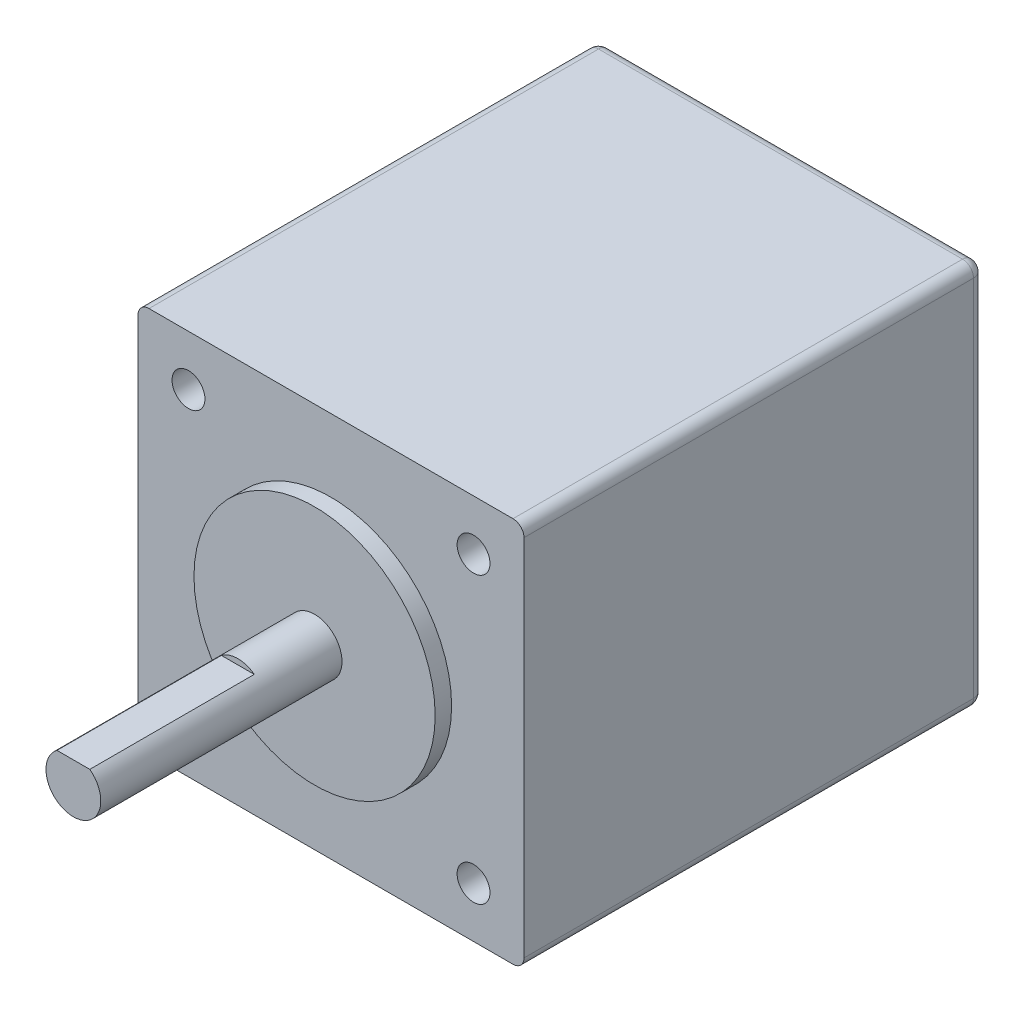
ISO-10303-21;
HEADER;
FILE_DESCRIPTION(('STEP AP214'),'2;1');
FILE_NAME('part.step','',(''),(''),'','','');
FILE_SCHEMA(('AUTOMOTIVE_DESIGN { 1 0 10303 214 1 1 1 1 }'));
ENDSEC;
DATA;
#1=APPLICATION_CONTEXT('core data for automotive mechanical design processes');
#2=APPLICATION_PROTOCOL_DEFINITION('international standard','automotive_design',2000,#1);
#3=PRODUCT_CONTEXT('',#1,'mechanical');
#4=PRODUCT('Part','Part','',(#3));
#5=PRODUCT_RELATED_PRODUCT_CATEGORY('part','',(#4));
#6=PRODUCT_DEFINITION_FORMATION('','',#4);
#7=PRODUCT_DEFINITION_CONTEXT('part definition',#1,'design');
#8=PRODUCT_DEFINITION('design','',#6,#7);
#9=PRODUCT_DEFINITION_SHAPE('','',#8);
#10=(LENGTH_UNIT() NAMED_UNIT(*) SI_UNIT(.MILLI.,.METRE.));
#11=(NAMED_UNIT(*) PLANE_ANGLE_UNIT() SI_UNIT($,.RADIAN.));
#12=(NAMED_UNIT(*) SI_UNIT($,.STERADIAN.) SOLID_ANGLE_UNIT());
#13=UNCERTAINTY_MEASURE_WITH_UNIT(LENGTH_MEASURE(1.E-05),#10,'distance_accuracy_value','');
#14=(GEOMETRIC_REPRESENTATION_CONTEXT(3) GLOBAL_UNCERTAINTY_ASSIGNED_CONTEXT((#13)) GLOBAL_UNIT_ASSIGNED_CONTEXT((#10,
#11,#12)) REPRESENTATION_CONTEXT('',''));
#15=CARTESIAN_POINT('',(0.,0.,0.));
#16=DIRECTION('',(0.,0.,1.));
#17=DIRECTION('',(1.,0.,0.));
#18=AXIS2_PLACEMENT_3D('',#15,#16,#17);
#19=CARTESIAN_POINT('',(0.,0.,43.5));
#20=DIRECTION('',(0.,0.,1.));
#21=DIRECTION('',(1.,0.,0.));
#22=AXIS2_PLACEMENT_3D('',#19,#20,#21);
#23=PLANE('',#22);
#24=CARTESIAN_POINT('',(0.,0.,43.5));
#25=DIRECTION('',(0.,0.,1.));
#26=DIRECTION('',(1.,0.,0.));
#27=AXIS2_PLACEMENT_3D('',#24,#25,#26);
#28=CIRCLE('',#27,11.);
#29=CARTESIAN_POINT('',(11.,0.,43.5));
#30=VERTEX_POINT('',#29);
#31=EDGE_CURVE('E144',#30,#30,#28,.T.);
#32=ORIENTED_EDGE('',*,*,#31,.T.);
#33=EDGE_LOOP('',(#32));
#34=FACE_BOUND('',#33,.T.);
#35=CARTESIAN_POINT('',(0.,0.,43.5));
#36=DIRECTION('',(0.,0.,1.));
#37=DIRECTION('',(1.,0.,0.));
#38=AXIS2_PLACEMENT_3D('',#35,#36,#37);
#39=CIRCLE('',#38,2.5);
#40=CARTESIAN_POINT('',(2.5,0.,43.5));
#41=VERTEX_POINT('',#40);
#42=EDGE_CURVE('E145',#41,#41,#39,.T.);
#43=ORIENTED_EDGE('',*,*,#42,.F.);
#44=EDGE_LOOP('',(#43));
#45=FACE_BOUND('',#44,.T.);
#46=ADVANCED_FACE('F33',(#34,#45),#23,.T.);
#47=CARTESIAN_POINT('',(17.6,17.6,42.));
#48=DIRECTION('',(0.,0.,-1.));
#49=DIRECTION('',(-1.,0.,0.));
#50=AXIS2_PLACEMENT_3D('',#47,#48,#49);
#51=PLANE('',#50);
#52=CARTESIAN_POINT('',(-12.9999999999997,-13.,42.));
#53=DIRECTION('',(0.,0.,1.));
#54=DIRECTION('',(1.,0.,0.));
#55=AXIS2_PLACEMENT_3D('',#52,#53,#54);
#56=CIRCLE('',#55,1.5);
#57=CARTESIAN_POINT('',(-11.4999999999997,-13.,42.));
#58=VERTEX_POINT('',#57);
#59=EDGE_CURVE('E237',#58,#58,#56,.T.);
#60=ORIENTED_EDGE('',*,*,#59,.F.);
#61=EDGE_LOOP('',(#60));
#62=FACE_BOUND('',#61,.T.);
#63=CARTESIAN_POINT('',(13.0000000000003,-12.9999999999997,42.));
#64=DIRECTION('',(0.,0.,1.));
#65=DIRECTION('',(1.,0.,0.));
#66=AXIS2_PLACEMENT_3D('',#63,#64,#65);
#67=CIRCLE('',#66,1.5);
#68=CARTESIAN_POINT('',(14.5000000000003,-12.9999999999997,42.));
#69=VERTEX_POINT('',#68);
#70=EDGE_CURVE('E245',#69,#69,#67,.T.);
#71=ORIENTED_EDGE('',*,*,#70,.F.);
#72=EDGE_LOOP('',(#71));
#73=FACE_BOUND('',#72,.T.);
#74=CARTESIAN_POINT('',(13.,13.0000000000003,42.));
#75=DIRECTION('',(0.,0.,1.));
#76=DIRECTION('',(1.,0.,0.));
#77=AXIS2_PLACEMENT_3D('',#74,#75,#76);
#78=CIRCLE('',#77,1.5);
#79=CARTESIAN_POINT('',(14.5,13.0000000000003,42.));
#80=VERTEX_POINT('',#79);
#81=EDGE_CURVE('E251',#80,#80,#78,.T.);
#82=ORIENTED_EDGE('',*,*,#81,.F.);
#83=EDGE_LOOP('',(#82));
#84=FACE_BOUND('',#83,.T.);
#85=CARTESIAN_POINT('',(-13.,13.,42.));
#86=DIRECTION('',(0.,0.,1.));
#87=DIRECTION('',(1.,0.,0.));
#88=AXIS2_PLACEMENT_3D('',#85,#86,#87);
#89=CIRCLE('',#88,1.5);
#90=CARTESIAN_POINT('',(-11.5,13.,42.));
#91=VERTEX_POINT('',#90);
#92=EDGE_CURVE('E257',#91,#91,#89,.T.);
#93=ORIENTED_EDGE('',*,*,#92,.F.);
#94=EDGE_LOOP('',(#93));
#95=FACE_BOUND('',#94,.T.);
#96=DIRECTION('',(0.,-1.,0.));
#97=VECTOR('',#96,1.);
#98=CARTESIAN_POINT('',(-17.6,-17.6,42.));
#99=LINE('',#98,#97);
#100=CARTESIAN_POINT('',(-17.6,16.6,42.));
#101=VERTEX_POINT('',#100);
#102=CARTESIAN_POINT('',(-17.6,-16.6,42.));
#103=VERTEX_POINT('',#102);
#104=EDGE_CURVE('E159',#101,#103,#99,.T.);
#105=ORIENTED_EDGE('',*,*,#104,.T.);
#106=CARTESIAN_POINT('',(-16.6,-16.6,42.));
#107=DIRECTION('',(0.,0.,-1.));
#108=DIRECTION('',(-1.,0.,0.));
#109=AXIS2_PLACEMENT_3D('',#106,#107,#108);
#110=CIRCLE('',#109,1.);
#111=CARTESIAN_POINT('',(-16.6,-17.6,42.));
#112=VERTEX_POINT('',#111);
#113=EDGE_CURVE('E11',#103,#112,#110,.F.);
#114=ORIENTED_EDGE('',*,*,#113,.T.);
#115=DIRECTION('',(1.,0.,0.));
#116=VECTOR('',#115,1.);
#117=CARTESIAN_POINT('',(-17.6,-17.6,42.));
#118=LINE('',#117,#116);
#119=CARTESIAN_POINT('',(16.6,-17.6,42.));
#120=VERTEX_POINT('',#119);
#121=EDGE_CURVE('E162',#112,#120,#118,.T.);
#122=ORIENTED_EDGE('',*,*,#121,.T.);
#123=CARTESIAN_POINT('',(16.6,-16.6,42.));
#124=DIRECTION('',(0.,0.,-1.));
#125=DIRECTION('',(-1.,0.,0.));
#126=AXIS2_PLACEMENT_3D('',#123,#124,#125);
#127=CIRCLE('',#126,1.);
#128=CARTESIAN_POINT('',(17.6,-16.6,42.));
#129=VERTEX_POINT('',#128);
#130=EDGE_CURVE('E42',#120,#129,#127,.F.);
#131=ORIENTED_EDGE('',*,*,#130,.T.);
#132=DIRECTION('',(0.,1.,0.));
#133=VECTOR('',#132,1.);
#134=CARTESIAN_POINT('',(17.6,-17.6,42.));
#135=LINE('',#134,#133);
#136=CARTESIAN_POINT('',(17.6,16.6,42.));
#137=VERTEX_POINT('',#136);
#138=EDGE_CURVE('E148',#129,#137,#135,.T.);
#139=ORIENTED_EDGE('',*,*,#138,.T.);
#140=CARTESIAN_POINT('',(16.6,16.6,42.));
#141=DIRECTION('',(0.,0.,-1.));
#142=DIRECTION('',(-1.,0.,0.));
#143=AXIS2_PLACEMENT_3D('',#140,#141,#142);
#144=CIRCLE('',#143,1.);
#145=CARTESIAN_POINT('',(16.6,17.6,42.));
#146=VERTEX_POINT('',#145);
#147=EDGE_CURVE('E200',#137,#146,#144,.F.);
#148=ORIENTED_EDGE('',*,*,#147,.T.);
#149=DIRECTION('',(-1.,0.,0.));
#150=VECTOR('',#149,1.);
#151=CARTESIAN_POINT('',(-17.6,17.6,42.));
#152=LINE('',#151,#150);
#153=CARTESIAN_POINT('',(-16.6,17.6,42.));
#154=VERTEX_POINT('',#153);
#155=EDGE_CURVE('E156',#146,#154,#152,.T.);
#156=ORIENTED_EDGE('',*,*,#155,.T.);
#157=CARTESIAN_POINT('',(-16.6,16.6,42.));
#158=DIRECTION('',(0.,0.,-1.));
#159=DIRECTION('',(-1.,0.,0.));
#160=AXIS2_PLACEMENT_3D('',#157,#158,#159);
#161=CIRCLE('',#160,1.);
#162=EDGE_CURVE('E202',#154,#101,#161,.F.);
#163=ORIENTED_EDGE('',*,*,#162,.T.);
#164=EDGE_LOOP('',(#105,#114,#122,#131,#139,#148,#156,#163));
#165=FACE_BOUND('',#164,.T.);
#166=CARTESIAN_POINT('',(0.,0.,42.));
#167=DIRECTION('',(0.,0.,-1.));
#168=DIRECTION('',(-1.,0.,0.));
#169=AXIS2_PLACEMENT_3D('',#166,#167,#168);
#170=CIRCLE('',#169,11.);
#171=CARTESIAN_POINT('',(-11.,0.,42.));
#172=VERTEX_POINT('',#171);
#173=EDGE_CURVE('E134',#172,#172,#170,.F.);
#174=ORIENTED_EDGE('',*,*,#173,.F.);
#175=EDGE_LOOP('',(#174));
#176=FACE_BOUND('',#175,.T.);
#177=ADVANCED_FACE('F278',(#62,#73,#84,#95,#165,#176),#51,.F.);
#178=CARTESIAN_POINT('',(17.6,-17.6,42.));
#179=DIRECTION('',(-1.,0.,0.));
#180=DIRECTION('',(0.,0.,1.));
#181=AXIS2_PLACEMENT_3D('',#178,#179,#180);
#182=PLANE('',#181);
#183=ORIENTED_EDGE('',*,*,#138,.F.);
#184=DIRECTION('',(0.,0.,-1.));
#185=VECTOR('',#184,1.);
#186=CARTESIAN_POINT('',(17.6,-16.6,42.));
#187=LINE('',#186,#185);
#188=CARTESIAN_POINT('',(17.6,-16.6,1.));
#189=VERTEX_POINT('',#188);
#190=EDGE_CURVE('E50',#129,#189,#187,.T.);
#191=ORIENTED_EDGE('',*,*,#190,.T.);
#192=DIRECTION('',(0.,1.,0.));
#193=VECTOR('',#192,1.);
#194=CARTESIAN_POINT('',(17.6,17.6,1.));
#195=LINE('',#194,#193);
#196=CARTESIAN_POINT('',(17.6,16.6,1.));
#197=VERTEX_POINT('',#196);
#198=EDGE_CURVE('E55',#189,#197,#195,.T.);
#199=ORIENTED_EDGE('',*,*,#198,.T.);
#200=DIRECTION('',(0.,0.,-1.));
#201=VECTOR('',#200,1.);
#202=CARTESIAN_POINT('',(17.6,16.6,42.));
#203=LINE('',#202,#201);
#204=EDGE_CURVE('E196',#197,#137,#203,.F.);
#205=ORIENTED_EDGE('',*,*,#204,.T.);
#206=EDGE_LOOP('',(#183,#191,#199,#205));
#207=FACE_BOUND('',#206,.T.);
#208=ADVANCED_FACE('F284',(#207),#182,.F.);
#209=CARTESIAN_POINT('',(-17.6,17.6,42.));
#210=DIRECTION('',(0.,-1.,0.));
#211=DIRECTION('',(0.,0.,-1.));
#212=AXIS2_PLACEMENT_3D('',#209,#210,#211);
#213=PLANE('',#212);
#214=DIRECTION('',(-1.,0.,0.));
#215=VECTOR('',#214,1.);
#216=CARTESIAN_POINT('',(-17.6,17.6,1.));
#217=LINE('',#216,#215);
#218=CARTESIAN_POINT('',(16.6,17.6,1.));
#219=VERTEX_POINT('',#218);
#220=CARTESIAN_POINT('',(-16.6,17.6,1.));
#221=VERTEX_POINT('',#220);
#222=EDGE_CURVE('E170',#219,#221,#217,.T.);
#223=ORIENTED_EDGE('',*,*,#222,.T.);
#224=DIRECTION('',(0.,0.,-1.));
#225=VECTOR('',#224,1.);
#226=CARTESIAN_POINT('',(-16.6,17.6,42.));
#227=LINE('',#226,#225);
#228=EDGE_CURVE('E173',#221,#154,#227,.F.);
#229=ORIENTED_EDGE('',*,*,#228,.T.);
#230=ORIENTED_EDGE('',*,*,#155,.F.);
#231=DIRECTION('',(0.,0.,-1.));
#232=VECTOR('',#231,1.);
#233=CARTESIAN_POINT('',(16.6,17.6,42.));
#234=LINE('',#233,#232);
#235=EDGE_CURVE('E168',#146,#219,#234,.T.);
#236=ORIENTED_EDGE('',*,*,#235,.T.);
#237=EDGE_LOOP('',(#223,#229,#230,#236));
#238=FACE_BOUND('',#237,.T.);
#239=ADVANCED_FACE('F305',(#238),#213,.F.);
#240=CARTESIAN_POINT('',(-17.6,-17.6,42.));
#241=DIRECTION('',(1.,0.,0.));
#242=DIRECTION('',(0.,0.,-1.));
#243=AXIS2_PLACEMENT_3D('',#240,#241,#242);
#244=PLANE('',#243);
#245=DIRECTION('',(0.,-1.,0.));
#246=VECTOR('',#245,1.);
#247=CARTESIAN_POINT('',(-17.6,-17.6,1.));
#248=LINE('',#247,#246);
#249=CARTESIAN_POINT('',(-17.6,16.6,1.));
#250=VERTEX_POINT('',#249);
#251=CARTESIAN_POINT('',(-17.6,-16.6,1.));
#252=VERTEX_POINT('',#251);
#253=EDGE_CURVE('E186',#250,#252,#248,.T.);
#254=ORIENTED_EDGE('',*,*,#253,.T.);
#255=DIRECTION('',(0.,0.,-1.));
#256=VECTOR('',#255,1.);
#257=CARTESIAN_POINT('',(-17.6,-16.6,42.));
#258=LINE('',#257,#256);
#259=EDGE_CURVE('E188',#252,#103,#258,.F.);
#260=ORIENTED_EDGE('',*,*,#259,.T.);
#261=ORIENTED_EDGE('',*,*,#104,.F.);
#262=DIRECTION('',(0.,0.,-1.));
#263=VECTOR('',#262,1.);
#264=CARTESIAN_POINT('',(-17.6,16.6,42.));
#265=LINE('',#264,#263);
#266=EDGE_CURVE('E184',#101,#250,#265,.T.);
#267=ORIENTED_EDGE('',*,*,#266,.T.);
#268=EDGE_LOOP('',(#254,#260,#261,#267));
#269=FACE_BOUND('',#268,.T.);
#270=ADVANCED_FACE('F301',(#269),#244,.F.);
#271=CARTESIAN_POINT('',(-17.6,-17.6,42.));
#272=DIRECTION('',(0.,1.,0.));
#273=DIRECTION('',(0.,0.,1.));
#274=AXIS2_PLACEMENT_3D('',#271,#272,#273);
#275=PLANE('',#274);
#276=ORIENTED_EDGE('',*,*,#121,.F.);
#277=DIRECTION('',(0.,0.,-1.));
#278=VECTOR('',#277,1.);
#279=CARTESIAN_POINT('',(-16.6,-17.6,42.));
#280=LINE('',#279,#278);
#281=CARTESIAN_POINT('',(-16.6,-17.6,1.));
#282=VERTEX_POINT('',#281);
#283=EDGE_CURVE('E194',#112,#282,#280,.T.);
#284=ORIENTED_EDGE('',*,*,#283,.T.);
#285=DIRECTION('',(1.,0.,0.));
#286=VECTOR('',#285,1.);
#287=CARTESIAN_POINT('',(17.6,-17.6,1.));
#288=LINE('',#287,#286);
#289=CARTESIAN_POINT('',(16.6,-17.6,1.));
#290=VERTEX_POINT('',#289);
#291=EDGE_CURVE('E192',#282,#290,#288,.T.);
#292=ORIENTED_EDGE('',*,*,#291,.T.);
#293=DIRECTION('',(0.,0.,-1.));
#294=VECTOR('',#293,1.);
#295=CARTESIAN_POINT('',(16.6,-17.6,42.));
#296=LINE('',#295,#294);
#297=EDGE_CURVE('E190',#290,#120,#296,.F.);
#298=ORIENTED_EDGE('',*,*,#297,.T.);
#299=EDGE_LOOP('',(#276,#284,#292,#298));
#300=FACE_BOUND('',#299,.T.);
#301=ADVANCED_FACE('F297',(#300),#275,.F.);
#302=CARTESIAN_POINT('',(17.6,17.6,0.));
#303=DIRECTION('',(0.,0.,-1.));
#304=DIRECTION('',(-1.,0.,0.));
#305=AXIS2_PLACEMENT_3D('',#302,#303,#304);
#306=PLANE('',#305);
#307=DIRECTION('',(0.,-1.,0.));
#308=VECTOR('',#307,1.);
#309=CARTESIAN_POINT('',(-16.6,17.6,0.));
#310=LINE('',#309,#308);
#311=CARTESIAN_POINT('',(-16.6,-16.6,0.));
#312=VERTEX_POINT('',#311);
#313=CARTESIAN_POINT('',(-16.6,16.6,0.));
#314=VERTEX_POINT('',#313);
#315=EDGE_CURVE('E179',#312,#314,#310,.F.);
#316=ORIENTED_EDGE('',*,*,#315,.T.);
#317=DIRECTION('',(-1.,0.,0.));
#318=VECTOR('',#317,1.);
#319=CARTESIAN_POINT('',(17.6,16.6,0.));
#320=LINE('',#319,#318);
#321=CARTESIAN_POINT('',(16.6,16.6,0.));
#322=VERTEX_POINT('',#321);
#323=EDGE_CURVE('E181',#314,#322,#320,.F.);
#324=ORIENTED_EDGE('',*,*,#323,.T.);
#325=DIRECTION('',(0.,1.,0.));
#326=VECTOR('',#325,1.);
#327=CARTESIAN_POINT('',(16.6,-17.6,0.));
#328=LINE('',#327,#326);
#329=CARTESIAN_POINT('',(16.6,-16.6,0.));
#330=VERTEX_POINT('',#329);
#331=EDGE_CURVE('E175',#322,#330,#328,.F.);
#332=ORIENTED_EDGE('',*,*,#331,.T.);
#333=DIRECTION('',(1.,0.,0.));
#334=VECTOR('',#333,1.);
#335=CARTESIAN_POINT('',(-17.6,-16.6,0.));
#336=LINE('',#335,#334);
#337=EDGE_CURVE('E177',#330,#312,#336,.F.);
#338=ORIENTED_EDGE('',*,*,#337,.T.);
#339=EDGE_LOOP('',(#316,#324,#332,#338));
#340=FACE_BOUND('',#339,.T.);
#341=ADVANCED_FACE('F292',(#340),#306,.T.);
#342=CARTESIAN_POINT('',(0.,0.,43.5));
#343=DIRECTION('',(0.,0.,-1.));
#344=DIRECTION('',(-1.,0.,0.));
#345=AXIS2_PLACEMENT_3D('',#342,#343,#344);
#346=CYLINDRICAL_SURFACE('',#345,11.);
#347=ORIENTED_EDGE('',*,*,#31,.F.);
#348=EDGE_LOOP('',(#347));
#349=FACE_BOUND('',#348,.T.);
#350=ORIENTED_EDGE('',*,*,#173,.T.);
#351=EDGE_LOOP('',(#350));
#352=FACE_BOUND('',#351,.T.);
#353=ADVANCED_FACE('F290',(#349,#352),#346,.T.);
#354=CARTESIAN_POINT('',(0.,0.,65.5));
#355=DIRECTION('',(0.,0.,-1.));
#356=DIRECTION('',(-1.,0.,0.));
#357=AXIS2_PLACEMENT_3D('',#354,#355,#356);
#358=CYLINDRICAL_SURFACE('',#357,2.5);
#359=CARTESIAN_POINT('',(0.,0.,65.5));
#360=DIRECTION('',(0.,0.,1.));
#361=DIRECTION('',(1.,0.,0.));
#362=AXIS2_PLACEMENT_3D('',#359,#360,#361);
#363=CIRCLE('',#362,2.5);
#364=CARTESIAN_POINT('',(-1.5,2.,65.5));
#365=VERTEX_POINT('',#364);
#366=CARTESIAN_POINT('',(1.5,2.,65.5));
#367=VERTEX_POINT('',#366);
#368=EDGE_CURVE('E140',#365,#367,#363,.T.);
#369=ORIENTED_EDGE('',*,*,#368,.F.);
#370=DIRECTION('',(0.,0.,-1.));
#371=VECTOR('',#370,1.);
#372=CARTESIAN_POINT('',(-1.5,2.,65.5));
#373=LINE('',#372,#371);
#374=CARTESIAN_POINT('',(-1.5,2.,50.5));
#375=VERTEX_POINT('',#374);
#376=EDGE_CURVE('E129',#365,#375,#373,.T.);
#377=ORIENTED_EDGE('',*,*,#376,.T.);
#378=CARTESIAN_POINT('',(0.,0.,50.5));
#379=DIRECTION('',(0.,0.,-1.));
#380=DIRECTION('',(-1.,0.,0.));
#381=AXIS2_PLACEMENT_3D('',#378,#379,#380);
#382=CIRCLE('',#381,2.5);
#383=CARTESIAN_POINT('',(1.5,2.,50.5));
#384=VERTEX_POINT('',#383);
#385=EDGE_CURVE('E133',#375,#384,#382,.T.);
#386=ORIENTED_EDGE('',*,*,#385,.T.);
#387=DIRECTION('',(0.,0.,-1.));
#388=VECTOR('',#387,1.);
#389=CARTESIAN_POINT('',(1.5,2.,65.5));
#390=LINE('',#389,#388);
#391=EDGE_CURVE('E126',#384,#367,#390,.F.);
#392=ORIENTED_EDGE('',*,*,#391,.T.);
#393=EDGE_LOOP('',(#369,#377,#386,#392));
#394=FACE_BOUND('',#393,.T.);
#395=ORIENTED_EDGE('',*,*,#42,.T.);
#396=EDGE_LOOP('',(#395));
#397=FACE_BOUND('',#396,.T.);
#398=ADVANCED_FACE('F138',(#394,#397),#358,.T.);
#399=CARTESIAN_POINT('',(0.,0.,65.5));
#400=DIRECTION('',(0.,0.,1.));
#401=DIRECTION('',(1.,0.,0.));
#402=AXIS2_PLACEMENT_3D('',#399,#400,#401);
#403=PLANE('',#402);
#404=DIRECTION('',(1.,0.,0.));
#405=VECTOR('',#404,1.);
#406=CARTESIAN_POINT('',(0.,2.,65.5));
#407=LINE('',#406,#405);
#408=EDGE_CURVE('E122',#365,#367,#407,.T.);
#409=ORIENTED_EDGE('',*,*,#408,.F.);
#410=ORIENTED_EDGE('',*,*,#368,.T.);
#411=EDGE_LOOP('',(#409,#410));
#412=FACE_BOUND('',#411,.T.);
#413=ADVANCED_FACE('F143',(#412),#403,.T.);
#414=CARTESIAN_POINT('',(-5.,2.5,50.5));
#415=DIRECTION('',(0.,0.,-1.));
#416=DIRECTION('',(-1.,0.,0.));
#417=AXIS2_PLACEMENT_3D('',#414,#415,#416);
#418=PLANE('',#417);
#419=DIRECTION('',(1.,0.,0.));
#420=VECTOR('',#419,1.);
#421=CARTESIAN_POINT('',(-5.,2.,50.5));
#422=LINE('',#421,#420);
#423=EDGE_CURVE('E141',#375,#384,#422,.T.);
#424=ORIENTED_EDGE('',*,*,#423,.T.);
#425=ORIENTED_EDGE('',*,*,#385,.F.);
#426=EDGE_LOOP('',(#424,#425));
#427=FACE_BOUND('',#426,.T.);
#428=ADVANCED_FACE('F266',(#427),#418,.F.);
#429=CARTESIAN_POINT('',(-5.,2.,65.5));
#430=DIRECTION('',(0.,-1.,0.));
#431=DIRECTION('',(0.,0.,-1.));
#432=AXIS2_PLACEMENT_3D('',#429,#430,#431);
#433=PLANE('',#432);
#434=ORIENTED_EDGE('',*,*,#408,.T.);
#435=ORIENTED_EDGE('',*,*,#391,.F.);
#436=ORIENTED_EDGE('',*,*,#423,.F.);
#437=ORIENTED_EDGE('',*,*,#376,.F.);
#438=EDGE_LOOP('',(#434,#435,#436,#437));
#439=FACE_BOUND('',#438,.T.);
#440=ADVANCED_FACE('F124',(#439),#433,.F.);
#441=CARTESIAN_POINT('',(-13.,13.,37.5));
#442=DIRECTION('',(0.,0.,1.));
#443=DIRECTION('',(1.,0.,0.));
#444=AXIS2_PLACEMENT_3D('',#441,#442,#443);
#445=CYLINDRICAL_SURFACE('',#444,1.5);
#446=CARTESIAN_POINT('',(-13.,13.,37.5));
#447=DIRECTION('',(0.,0.,1.));
#448=DIRECTION('',(1.,0.,0.));
#449=AXIS2_PLACEMENT_3D('',#446,#447,#448);
#450=CIRCLE('',#449,1.5);
#451=CARTESIAN_POINT('',(-11.5,13.,37.5));
#452=VERTEX_POINT('',#451);
#453=EDGE_CURVE('E260',#452,#452,#450,.T.);
#454=ORIENTED_EDGE('',*,*,#453,.F.);
#455=EDGE_LOOP('',(#454));
#456=FACE_BOUND('',#455,.T.);
#457=ORIENTED_EDGE('',*,*,#92,.T.);
#458=EDGE_LOOP('',(#457));
#459=FACE_BOUND('',#458,.T.);
#460=ADVANCED_FACE('F273',(#456,#459),#445,.F.);
#461=CARTESIAN_POINT('',(-13.,13.,37.5));
#462=DIRECTION('',(0.,0.,1.));
#463=DIRECTION('',(1.,0.,0.));
#464=AXIS2_PLACEMENT_3D('',#461,#462,#463);
#465=PLANE('',#464);
#466=ORIENTED_EDGE('',*,*,#453,.T.);
#467=EDGE_LOOP('',(#466));
#468=FACE_BOUND('',#467,.T.);
#469=ADVANCED_FACE('F418',(#468),#465,.T.);
#470=CARTESIAN_POINT('',(13.,13.0000000000003,37.5));
#471=DIRECTION('',(0.,0.,1.));
#472=DIRECTION('',(1.,0.,0.));
#473=AXIS2_PLACEMENT_3D('',#470,#471,#472);
#474=CYLINDRICAL_SURFACE('',#473,1.5);
#475=CARTESIAN_POINT('',(13.,13.0000000000003,37.5));
#476=DIRECTION('',(0.,0.,1.));
#477=DIRECTION('',(1.,0.,0.));
#478=AXIS2_PLACEMENT_3D('',#475,#476,#477);
#479=CIRCLE('',#478,1.5);
#480=CARTESIAN_POINT('',(14.5,13.0000000000003,37.5));
#481=VERTEX_POINT('',#480);
#482=EDGE_CURVE('E254',#481,#481,#479,.T.);
#483=ORIENTED_EDGE('',*,*,#482,.F.);
#484=EDGE_LOOP('',(#483));
#485=FACE_BOUND('',#484,.T.);
#486=ORIENTED_EDGE('',*,*,#81,.T.);
#487=EDGE_LOOP('',(#486));
#488=FACE_BOUND('',#487,.T.);
#489=ADVANCED_FACE('F414',(#485,#488),#474,.F.);
#490=CARTESIAN_POINT('',(13.,13.0000000000003,37.5));
#491=DIRECTION('',(0.,0.,1.));
#492=DIRECTION('',(1.,0.,0.));
#493=AXIS2_PLACEMENT_3D('',#490,#491,#492);
#494=PLANE('',#493);
#495=ORIENTED_EDGE('',*,*,#482,.T.);
#496=EDGE_LOOP('',(#495));
#497=FACE_BOUND('',#496,.T.);
#498=ADVANCED_FACE('F410',(#497),#494,.T.);
#499=CARTESIAN_POINT('',(13.0000000000003,-12.9999999999997,37.5));
#500=DIRECTION('',(0.,0.,1.));
#501=DIRECTION('',(1.,0.,0.));
#502=AXIS2_PLACEMENT_3D('',#499,#500,#501);
#503=CYLINDRICAL_SURFACE('',#502,1.5);
#504=CARTESIAN_POINT('',(13.0000000000003,-12.9999999999997,37.5));
#505=DIRECTION('',(0.,0.,1.));
#506=DIRECTION('',(1.,0.,0.));
#507=AXIS2_PLACEMENT_3D('',#504,#505,#506);
#508=CIRCLE('',#507,1.5);
#509=CARTESIAN_POINT('',(14.5000000000003,-12.9999999999997,37.5));
#510=VERTEX_POINT('',#509);
#511=EDGE_CURVE('E248',#510,#510,#508,.T.);
#512=ORIENTED_EDGE('',*,*,#511,.F.);
#513=EDGE_LOOP('',(#512));
#514=FACE_BOUND('',#513,.T.);
#515=ORIENTED_EDGE('',*,*,#70,.T.);
#516=EDGE_LOOP('',(#515));
#517=FACE_BOUND('',#516,.T.);
#518=ADVANCED_FACE('F406',(#514,#517),#503,.F.);
#519=CARTESIAN_POINT('',(13.0000000000003,-12.9999999999997,37.5));
#520=DIRECTION('',(0.,0.,1.));
#521=DIRECTION('',(1.,0.,0.));
#522=AXIS2_PLACEMENT_3D('',#519,#520,#521);
#523=PLANE('',#522);
#524=ORIENTED_EDGE('',*,*,#511,.T.);
#525=EDGE_LOOP('',(#524));
#526=FACE_BOUND('',#525,.T.);
#527=ADVANCED_FACE('F400',(#526),#523,.T.);
#528=CARTESIAN_POINT('',(-12.9999999999997,-13.,37.5));
#529=DIRECTION('',(0.,0.,1.));
#530=DIRECTION('',(1.,0.,0.));
#531=AXIS2_PLACEMENT_3D('',#528,#529,#530);
#532=CYLINDRICAL_SURFACE('',#531,1.5);
#533=CARTESIAN_POINT('',(-12.9999999999997,-13.,37.5));
#534=DIRECTION('',(0.,0.,1.));
#535=DIRECTION('',(1.,0.,0.));
#536=AXIS2_PLACEMENT_3D('',#533,#534,#535);
#537=CIRCLE('',#536,1.5);
#538=CARTESIAN_POINT('',(-11.4999999999997,-13.,37.5));
#539=VERTEX_POINT('',#538);
#540=EDGE_CURVE('E240',#539,#539,#537,.T.);
#541=ORIENTED_EDGE('',*,*,#540,.F.);
#542=EDGE_LOOP('',(#541));
#543=FACE_BOUND('',#542,.T.);
#544=ORIENTED_EDGE('',*,*,#59,.T.);
#545=EDGE_LOOP('',(#544));
#546=FACE_BOUND('',#545,.T.);
#547=ADVANCED_FACE('F394',(#543,#546),#532,.F.);
#548=CARTESIAN_POINT('',(-12.9999999999997,-13.,37.5));
#549=DIRECTION('',(0.,0.,1.));
#550=DIRECTION('',(1.,0.,0.));
#551=AXIS2_PLACEMENT_3D('',#548,#549,#550);
#552=PLANE('',#551);
#553=ORIENTED_EDGE('',*,*,#540,.T.);
#554=EDGE_LOOP('',(#553));
#555=FACE_BOUND('',#554,.T.);
#556=ADVANCED_FACE('F356',(#555),#552,.T.);
#557=CARTESIAN_POINT('',(16.6,-16.6,42.));
#558=DIRECTION('',(0.,0.,-1.));
#559=DIRECTION('',(-1.,0.,0.));
#560=AXIS2_PLACEMENT_3D('',#557,#558,#559);
#561=CYLINDRICAL_SURFACE('',#560,1.);
#562=ORIENTED_EDGE('',*,*,#130,.F.);
#563=ORIENTED_EDGE('',*,*,#297,.F.);
#564=CARTESIAN_POINT('',(16.6,-16.6,1.));
#565=DIRECTION('',(0.,0.,-1.));
#566=DIRECTION('',(-1.,0.,0.));
#567=AXIS2_PLACEMENT_3D('',#564,#565,#566);
#568=CIRCLE('',#567,1.);
#569=EDGE_CURVE('E232',#189,#290,#568,.T.);
#570=ORIENTED_EDGE('',*,*,#569,.F.);
#571=ORIENTED_EDGE('',*,*,#190,.F.);
#572=EDGE_LOOP('',(#562,#563,#570,#571));
#573=FACE_BOUND('',#572,.T.);
#574=ADVANCED_FACE('F35',(#573),#561,.T.);
#575=CARTESIAN_POINT('',(-16.6,-16.6,42.));
#576=DIRECTION('',(0.,0.,-1.));
#577=DIRECTION('',(-1.,0.,0.));
#578=AXIS2_PLACEMENT_3D('',#575,#576,#577);
#579=CYLINDRICAL_SURFACE('',#578,1.);
#580=ORIENTED_EDGE('',*,*,#113,.F.);
#581=ORIENTED_EDGE('',*,*,#259,.F.);
#582=CARTESIAN_POINT('',(-16.6,-16.6,1.));
#583=DIRECTION('',(0.,0.,-1.));
#584=DIRECTION('',(-1.,0.,0.));
#585=AXIS2_PLACEMENT_3D('',#582,#583,#584);
#586=CIRCLE('',#585,1.);
#587=EDGE_CURVE('E230',#282,#252,#586,.T.);
#588=ORIENTED_EDGE('',*,*,#587,.F.);
#589=ORIENTED_EDGE('',*,*,#283,.F.);
#590=EDGE_LOOP('',(#580,#581,#588,#589));
#591=FACE_BOUND('',#590,.T.);
#592=ADVANCED_FACE('F349',(#591),#579,.T.);
#593=CARTESIAN_POINT('',(-17.6,-16.6,1.));
#594=DIRECTION('',(-1.,0.,0.));
#595=DIRECTION('',(0.,0.,1.));
#596=AXIS2_PLACEMENT_3D('',#593,#594,#595);
#597=CYLINDRICAL_SURFACE('',#596,1.);
#598=CARTESIAN_POINT('',(16.6,-16.6,1.));
#599=DIRECTION('',(1.,0.,0.));
#600=DIRECTION('',(0.,0.,-1.));
#601=AXIS2_PLACEMENT_3D('',#598,#599,#600);
#602=CIRCLE('',#601,1.);
#603=EDGE_CURVE('E37',#290,#330,#602,.T.);
#604=ORIENTED_EDGE('',*,*,#603,.F.);
#605=ORIENTED_EDGE('',*,*,#291,.F.);
#606=CARTESIAN_POINT('',(-16.6,-16.6,1.));
#607=DIRECTION('',(-1.,0.,0.));
#608=DIRECTION('',(0.,0.,1.));
#609=AXIS2_PLACEMENT_3D('',#606,#607,#608);
#610=CIRCLE('',#609,1.);
#611=EDGE_CURVE('E227',#312,#282,#610,.T.);
#612=ORIENTED_EDGE('',*,*,#611,.F.);
#613=ORIENTED_EDGE('',*,*,#337,.F.);
#614=EDGE_LOOP('',(#604,#605,#612,#613));
#615=FACE_BOUND('',#614,.T.);
#616=ADVANCED_FACE('F347',(#615),#597,.T.);
#617=CARTESIAN_POINT('',(16.6,-16.6,1.));
#618=DIRECTION('',(0.,0.,1.));
#619=DIRECTION('',(1.,0.,0.));
#620=AXIS2_PLACEMENT_3D('',#617,#618,#619);
#621=SPHERICAL_SURFACE('',#620,1.);
#622=ORIENTED_EDGE('',*,*,#569,.T.);
#623=ORIENTED_EDGE('',*,*,#603,.T.);
#624=CARTESIAN_POINT('',(16.6,-16.6,1.));
#625=DIRECTION('',(0.,-1.,0.));
#626=DIRECTION('',(0.,0.,-1.));
#627=AXIS2_PLACEMENT_3D('',#624,#625,#626);
#628=CIRCLE('',#627,1.);
#629=EDGE_CURVE('E224',#189,#330,#628,.F.);
#630=ORIENTED_EDGE('',*,*,#629,.F.);
#631=EDGE_LOOP('',(#622,#623,#630));
#632=FACE_BOUND('',#631,.T.);
#633=ADVANCED_FACE('F343',(#632),#621,.T.);
#634=CARTESIAN_POINT('',(-16.6,-16.6,1.));
#635=DIRECTION('',(0.,0.,1.));
#636=DIRECTION('',(1.,0.,0.));
#637=AXIS2_PLACEMENT_3D('',#634,#635,#636);
#638=SPHERICAL_SURFACE('',#637,1.);
#639=ORIENTED_EDGE('',*,*,#611,.T.);
#640=ORIENTED_EDGE('',*,*,#587,.T.);
#641=CARTESIAN_POINT('',(-16.6,-16.6,1.));
#642=DIRECTION('',(0.,-1.,0.));
#643=DIRECTION('',(0.,0.,-1.));
#644=AXIS2_PLACEMENT_3D('',#641,#642,#643);
#645=CIRCLE('',#644,1.);
#646=EDGE_CURVE('E221',#312,#252,#645,.F.);
#647=ORIENTED_EDGE('',*,*,#646,.F.);
#648=EDGE_LOOP('',(#639,#640,#647));
#649=FACE_BOUND('',#648,.T.);
#650=ADVANCED_FACE('F339',(#649),#638,.T.);
#651=CARTESIAN_POINT('',(16.6,-17.6,1.));
#652=DIRECTION('',(0.,-1.,0.));
#653=DIRECTION('',(0.,0.,-1.));
#654=AXIS2_PLACEMENT_3D('',#651,#652,#653);
#655=CYLINDRICAL_SURFACE('',#654,1.);
#656=ORIENTED_EDGE('',*,*,#629,.T.);
#657=ORIENTED_EDGE('',*,*,#331,.F.);
#658=CARTESIAN_POINT('',(16.6,16.6,1.));
#659=DIRECTION('',(0.,1.,0.));
#660=DIRECTION('',(0.,0.,1.));
#661=AXIS2_PLACEMENT_3D('',#658,#659,#660);
#662=CIRCLE('',#661,1.);
#663=EDGE_CURVE('E218',#197,#322,#662,.T.);
#664=ORIENTED_EDGE('',*,*,#663,.F.);
#665=ORIENTED_EDGE('',*,*,#198,.F.);
#666=EDGE_LOOP('',(#656,#657,#664,#665));
#667=FACE_BOUND('',#666,.T.);
#668=ADVANCED_FACE('F335',(#667),#655,.T.);
#669=CARTESIAN_POINT('',(16.6,16.6,42.));
#670=DIRECTION('',(0.,0.,-1.));
#671=DIRECTION('',(-1.,0.,0.));
#672=AXIS2_PLACEMENT_3D('',#669,#670,#671);
#673=CYLINDRICAL_SURFACE('',#672,1.);
#674=ORIENTED_EDGE('',*,*,#147,.F.);
#675=ORIENTED_EDGE('',*,*,#204,.F.);
#676=CARTESIAN_POINT('',(16.6,16.6,1.));
#677=DIRECTION('',(0.,0.,-1.));
#678=DIRECTION('',(-1.,0.,0.));
#679=AXIS2_PLACEMENT_3D('',#676,#677,#678);
#680=CIRCLE('',#679,1.);
#681=EDGE_CURVE('E215',#219,#197,#680,.T.);
#682=ORIENTED_EDGE('',*,*,#681,.F.);
#683=ORIENTED_EDGE('',*,*,#235,.F.);
#684=EDGE_LOOP('',(#674,#675,#682,#683));
#685=FACE_BOUND('',#684,.T.);
#686=ADVANCED_FACE('F331',(#685),#673,.T.);
#687=CARTESIAN_POINT('',(-16.6,16.6,42.));
#688=DIRECTION('',(0.,0.,-1.));
#689=DIRECTION('',(-1.,0.,0.));
#690=AXIS2_PLACEMENT_3D('',#687,#688,#689);
#691=CYLINDRICAL_SURFACE('',#690,1.);
#692=ORIENTED_EDGE('',*,*,#162,.F.);
#693=ORIENTED_EDGE('',*,*,#228,.F.);
#694=CARTESIAN_POINT('',(-16.6,16.6,1.));
#695=DIRECTION('',(0.,0.,-1.));
#696=DIRECTION('',(-1.,0.,0.));
#697=AXIS2_PLACEMENT_3D('',#694,#695,#696);
#698=CIRCLE('',#697,1.);
#699=EDGE_CURVE('E212',#250,#221,#698,.T.);
#700=ORIENTED_EDGE('',*,*,#699,.F.);
#701=ORIENTED_EDGE('',*,*,#266,.F.);
#702=EDGE_LOOP('',(#692,#693,#700,#701));
#703=FACE_BOUND('',#702,.T.);
#704=ADVANCED_FACE('F327',(#703),#691,.T.);
#705=CARTESIAN_POINT('',(-16.6,-17.6,1.));
#706=DIRECTION('',(0.,1.,0.));
#707=DIRECTION('',(0.,0.,1.));
#708=AXIS2_PLACEMENT_3D('',#705,#706,#707);
#709=CYLINDRICAL_SURFACE('',#708,1.);
#710=ORIENTED_EDGE('',*,*,#646,.T.);
#711=ORIENTED_EDGE('',*,*,#253,.F.);
#712=CARTESIAN_POINT('',(-16.6,16.6,1.));
#713=DIRECTION('',(0.,1.,0.));
#714=DIRECTION('',(-1.,0.,0.));
#715=AXIS2_PLACEMENT_3D('',#712,#713,#714);
#716=CIRCLE('',#715,1.);
#717=EDGE_CURVE('E209',#314,#250,#716,.T.);
#718=ORIENTED_EDGE('',*,*,#717,.F.);
#719=ORIENTED_EDGE('',*,*,#315,.F.);
#720=EDGE_LOOP('',(#710,#711,#718,#719));
#721=FACE_BOUND('',#720,.T.);
#722=ADVANCED_FACE('F323',(#721),#709,.T.);
#723=CARTESIAN_POINT('',(16.6,16.6,1.));
#724=DIRECTION('',(0.,0.,1.));
#725=DIRECTION('',(1.,0.,0.));
#726=AXIS2_PLACEMENT_3D('',#723,#724,#725);
#727=SPHERICAL_SURFACE('',#726,1.);
#728=ORIENTED_EDGE('',*,*,#681,.T.);
#729=ORIENTED_EDGE('',*,*,#663,.T.);
#730=CARTESIAN_POINT('',(16.6,16.6,1.));
#731=DIRECTION('',(1.,0.,0.));
#732=DIRECTION('',(0.,1.,0.));
#733=AXIS2_PLACEMENT_3D('',#730,#731,#732);
#734=CIRCLE('',#733,1.);
#735=EDGE_CURVE('E207',#219,#322,#734,.F.);
#736=ORIENTED_EDGE('',*,*,#735,.F.);
#737=EDGE_LOOP('',(#728,#729,#736));
#738=FACE_BOUND('',#737,.T.);
#739=ADVANCED_FACE('F319',(#738),#727,.T.);
#740=CARTESIAN_POINT('',(-16.6,16.6,1.));
#741=DIRECTION('',(0.,0.,1.));
#742=DIRECTION('',(1.,0.,0.));
#743=AXIS2_PLACEMENT_3D('',#740,#741,#742);
#744=SPHERICAL_SURFACE('',#743,1.);
#745=ORIENTED_EDGE('',*,*,#717,.T.);
#746=ORIENTED_EDGE('',*,*,#699,.T.);
#747=CARTESIAN_POINT('',(-16.6,16.6,1.));
#748=DIRECTION('',(-1.,0.,0.));
#749=DIRECTION('',(0.,0.,1.));
#750=AXIS2_PLACEMENT_3D('',#747,#748,#749);
#751=CIRCLE('',#750,1.);
#752=EDGE_CURVE('E205',#314,#221,#751,.F.);
#753=ORIENTED_EDGE('',*,*,#752,.F.);
#754=EDGE_LOOP('',(#745,#746,#753));
#755=FACE_BOUND('',#754,.T.);
#756=ADVANCED_FACE('F315',(#755),#744,.T.);
#757=CARTESIAN_POINT('',(-17.6,16.6,1.));
#758=DIRECTION('',(1.,0.,0.));
#759=DIRECTION('',(0.,0.,-1.));
#760=AXIS2_PLACEMENT_3D('',#757,#758,#759);
#761=CYLINDRICAL_SURFACE('',#760,1.);
#762=ORIENTED_EDGE('',*,*,#735,.T.);
#763=ORIENTED_EDGE('',*,*,#323,.F.);
#764=ORIENTED_EDGE('',*,*,#752,.T.);
#765=ORIENTED_EDGE('',*,*,#222,.F.);
#766=EDGE_LOOP('',(#762,#763,#764,#765));
#767=FACE_BOUND('',#766,.T.);
#768=ADVANCED_FACE('F312',(#767),#761,.T.);
#769=CLOSED_SHELL('',(#46,#177,#208,#239,#270,#301,#341,#353,#398,#413,#428,#440,#460,#469,#489,
#498,#518,#527,#547,#556,#574,#592,#616,#633,#650,#668,#686,#704,#722,#739,#756,#768));
#770=MANIFOLD_SOLID_BREP('B2',#769);
#771=ADVANCED_BREP_SHAPE_REPRESENTATION('',(#18,#770),#14);
#772=SHAPE_DEFINITION_REPRESENTATION(#9,#771);
ENDSEC;
END-ISO-10303-21;
